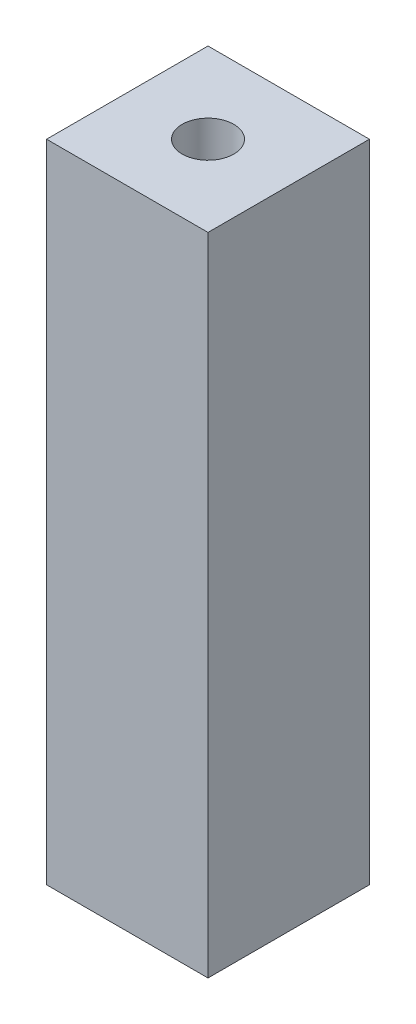
ISO-10303-21;
HEADER;
FILE_DESCRIPTION(('STEP AP214'),'2;1');
FILE_NAME('part.step','',(''),(''),'','','');
FILE_SCHEMA(('AUTOMOTIVE_DESIGN { 1 0 10303 214 1 1 1 1 }'));
ENDSEC;
DATA;
#1=APPLICATION_CONTEXT('core data for automotive mechanical design processes');
#2=APPLICATION_PROTOCOL_DEFINITION('international standard','automotive_design',2000,#1);
#3=PRODUCT_CONTEXT('',#1,'mechanical');
#4=PRODUCT('Part','Part','',(#3));
#5=PRODUCT_RELATED_PRODUCT_CATEGORY('part','',(#4));
#6=PRODUCT_DEFINITION_FORMATION('','',#4);
#7=PRODUCT_DEFINITION_CONTEXT('part definition',#1,'design');
#8=PRODUCT_DEFINITION('design','',#6,#7);
#9=PRODUCT_DEFINITION_SHAPE('','',#8);
#10=(LENGTH_UNIT() NAMED_UNIT(*) SI_UNIT(.MILLI.,.METRE.));
#11=(NAMED_UNIT(*) PLANE_ANGLE_UNIT() SI_UNIT($,.RADIAN.));
#12=(NAMED_UNIT(*) SI_UNIT($,.STERADIAN.) SOLID_ANGLE_UNIT());
#13=UNCERTAINTY_MEASURE_WITH_UNIT(LENGTH_MEASURE(1.E-05),#10,'distance_accuracy_value','');
#14=(GEOMETRIC_REPRESENTATION_CONTEXT(3) GLOBAL_UNCERTAINTY_ASSIGNED_CONTEXT((#13)) GLOBAL_UNIT_ASSIGNED_CONTEXT((#10,
#11,#12)) REPRESENTATION_CONTEXT('',''));
#15=CARTESIAN_POINT('',(0.,0.,0.));
#16=DIRECTION('',(0.,0.,1.));
#17=DIRECTION('',(1.,0.,0.));
#18=AXIS2_PLACEMENT_3D('',#15,#16,#17);
#19=CARTESIAN_POINT('',(0.,40.,0.));
#20=DIRECTION('',(0.,1.,0.));
#21=DIRECTION('',(0.,0.,1.));
#22=AXIS2_PLACEMENT_3D('',#19,#20,#21);
#23=PLANE('',#22);
#24=DIRECTION('',(0.,0.,-1.));
#25=VECTOR('',#24,1.);
#26=CARTESIAN_POINT('',(5.,40.,-5.));
#27=LINE('',#26,#25);
#28=CARTESIAN_POINT('',(5.,40.,5.));
#29=VERTEX_POINT('',#28);
#30=CARTESIAN_POINT('',(5.,40.,-5.));
#31=VERTEX_POINT('',#30);
#32=EDGE_CURVE('E88',#29,#31,#27,.T.);
#33=ORIENTED_EDGE('',*,*,#32,.T.);
#34=DIRECTION('',(-1.,0.,0.));
#35=VECTOR('',#34,1.);
#36=CARTESIAN_POINT('',(-5.,40.,-5.));
#37=LINE('',#36,#35);
#38=CARTESIAN_POINT('',(-5.,40.,-5.));
#39=VERTEX_POINT('',#38);
#40=EDGE_CURVE('E83',#31,#39,#37,.T.);
#41=ORIENTED_EDGE('',*,*,#40,.T.);
#42=DIRECTION('',(0.,0.,1.));
#43=VECTOR('',#42,1.);
#44=CARTESIAN_POINT('',(-5.,40.,-5.));
#45=LINE('',#44,#43);
#46=CARTESIAN_POINT('',(-5.,40.,5.));
#47=VERTEX_POINT('',#46);
#48=EDGE_CURVE('E86',#39,#47,#45,.T.);
#49=ORIENTED_EDGE('',*,*,#48,.T.);
#50=DIRECTION('',(1.,0.,0.));
#51=VECTOR('',#50,1.);
#52=CARTESIAN_POINT('',(-5.,40.,5.));
#53=LINE('',#52,#51);
#54=EDGE_CURVE('E53',#47,#29,#53,.T.);
#55=ORIENTED_EDGE('',*,*,#54,.T.);
#56=EDGE_LOOP('',(#33,#41,#49,#55));
#57=FACE_BOUND('',#56,.T.);
#58=CARTESIAN_POINT('',(0.,40.,0.));
#59=DIRECTION('',(0.,1.,0.));
#60=DIRECTION('',(0.,0.,1.));
#61=AXIS2_PLACEMENT_3D('',#58,#59,#60);
#62=CIRCLE('',#61,1.6);
#63=CARTESIAN_POINT('',(0.,40.,1.6));
#64=VERTEX_POINT('',#63);
#65=EDGE_CURVE('E103',#64,#64,#62,.T.);
#66=ORIENTED_EDGE('',*,*,#65,.F.);
#67=EDGE_LOOP('',(#66));
#68=FACE_BOUND('',#67,.T.);
#69=ADVANCED_FACE('F36',(#57,#68),#23,.T.);
#70=CARTESIAN_POINT('',(0.,0.,0.));
#71=DIRECTION('',(0.,1.,0.));
#72=DIRECTION('',(0.,0.,1.));
#73=AXIS2_PLACEMENT_3D('',#70,#71,#72);
#74=PLANE('',#73);
#75=DIRECTION('',(0.,0.,-1.));
#76=VECTOR('',#75,1.);
#77=CARTESIAN_POINT('',(5.,0.,-5.));
#78=LINE('',#77,#76);
#79=CARTESIAN_POINT('',(5.,0.,5.));
#80=VERTEX_POINT('',#79);
#81=CARTESIAN_POINT('',(5.,0.,-5.));
#82=VERTEX_POINT('',#81);
#83=EDGE_CURVE('E100',#80,#82,#78,.T.);
#84=ORIENTED_EDGE('',*,*,#83,.F.);
#85=DIRECTION('',(1.,0.,0.));
#86=VECTOR('',#85,1.);
#87=CARTESIAN_POINT('',(-5.,0.,5.));
#88=LINE('',#87,#86);
#89=CARTESIAN_POINT('',(-5.,0.,5.));
#90=VERTEX_POINT('',#89);
#91=EDGE_CURVE('E76',#90,#80,#88,.T.);
#92=ORIENTED_EDGE('',*,*,#91,.F.);
#93=DIRECTION('',(0.,0.,1.));
#94=VECTOR('',#93,1.);
#95=CARTESIAN_POINT('',(-5.,0.,-5.));
#96=LINE('',#95,#94);
#97=CARTESIAN_POINT('',(-5.,0.,-5.));
#98=VERTEX_POINT('',#97);
#99=EDGE_CURVE('E70',#98,#90,#96,.T.);
#100=ORIENTED_EDGE('',*,*,#99,.F.);
#101=DIRECTION('',(-1.,0.,0.));
#102=VECTOR('',#101,1.);
#103=CARTESIAN_POINT('',(-5.,0.,-5.));
#104=LINE('',#103,#102);
#105=EDGE_CURVE('E92',#82,#98,#104,.T.);
#106=ORIENTED_EDGE('',*,*,#105,.F.);
#107=EDGE_LOOP('',(#84,#92,#100,#106));
#108=FACE_BOUND('',#107,.T.);
#109=CARTESIAN_POINT('',(0.,0.,0.));
#110=DIRECTION('',(0.,1.,0.));
#111=DIRECTION('',(0.,0.,1.));
#112=AXIS2_PLACEMENT_3D('',#109,#110,#111);
#113=CIRCLE('',#112,1.6);
#114=CARTESIAN_POINT('',(0.,0.,1.6));
#115=VERTEX_POINT('',#114);
#116=EDGE_CURVE('E115',#115,#115,#113,.T.);
#117=ORIENTED_EDGE('',*,*,#116,.T.);
#118=EDGE_LOOP('',(#117));
#119=FACE_BOUND('',#118,.T.);
#120=ADVANCED_FACE('F111',(#108,#119),#74,.F.);
#121=CARTESIAN_POINT('',(5.,40.,-5.));
#122=DIRECTION('',(-1.,0.,0.));
#123=DIRECTION('',(0.,0.,1.));
#124=AXIS2_PLACEMENT_3D('',#121,#122,#123);
#125=PLANE('',#124);
#126=ORIENTED_EDGE('',*,*,#83,.T.);
#127=DIRECTION('',(0.,-1.,0.));
#128=VECTOR('',#127,1.);
#129=CARTESIAN_POINT('',(5.,40.,-5.));
#130=LINE('',#129,#128);
#131=EDGE_CURVE('E11',#31,#82,#130,.T.);
#132=ORIENTED_EDGE('',*,*,#131,.F.);
#133=ORIENTED_EDGE('',*,*,#32,.F.);
#134=DIRECTION('',(0.,-1.,0.));
#135=VECTOR('',#134,1.);
#136=CARTESIAN_POINT('',(5.,40.,5.));
#137=LINE('',#136,#135);
#138=EDGE_CURVE('E96',#29,#80,#137,.T.);
#139=ORIENTED_EDGE('',*,*,#138,.T.);
#140=EDGE_LOOP('',(#126,#132,#133,#139));
#141=FACE_BOUND('',#140,.T.);
#142=ADVANCED_FACE('F38',(#141),#125,.F.);
#143=CARTESIAN_POINT('',(-5.,40.,-5.));
#144=DIRECTION('',(0.,0.,1.));
#145=DIRECTION('',(1.,0.,0.));
#146=AXIS2_PLACEMENT_3D('',#143,#144,#145);
#147=PLANE('',#146);
#148=ORIENTED_EDGE('',*,*,#105,.T.);
#149=DIRECTION('',(0.,-1.,0.));
#150=VECTOR('',#149,1.);
#151=CARTESIAN_POINT('',(-5.,40.,-5.));
#152=LINE('',#151,#150);
#153=EDGE_CURVE('E45',#39,#98,#152,.T.);
#154=ORIENTED_EDGE('',*,*,#153,.F.);
#155=ORIENTED_EDGE('',*,*,#40,.F.);
#156=ORIENTED_EDGE('',*,*,#131,.T.);
#157=EDGE_LOOP('',(#148,#154,#155,#156));
#158=FACE_BOUND('',#157,.T.);
#159=ADVANCED_FACE('F91',(#158),#147,.F.);
#160=CARTESIAN_POINT('',(-5.,40.,-5.));
#161=DIRECTION('',(1.,0.,0.));
#162=DIRECTION('',(0.,0.,-1.));
#163=AXIS2_PLACEMENT_3D('',#160,#161,#162);
#164=PLANE('',#163);
#165=ORIENTED_EDGE('',*,*,#99,.T.);
#166=DIRECTION('',(0.,-1.,0.));
#167=VECTOR('',#166,1.);
#168=CARTESIAN_POINT('',(-5.,40.,5.));
#169=LINE('',#168,#167);
#170=EDGE_CURVE('E93',#47,#90,#169,.T.);
#171=ORIENTED_EDGE('',*,*,#170,.F.);
#172=ORIENTED_EDGE('',*,*,#48,.F.);
#173=ORIENTED_EDGE('',*,*,#153,.T.);
#174=EDGE_LOOP('',(#165,#171,#172,#173));
#175=FACE_BOUND('',#174,.T.);
#176=ADVANCED_FACE('F94',(#175),#164,.F.);
#177=CARTESIAN_POINT('',(-5.,40.,5.));
#178=DIRECTION('',(0.,0.,-1.));
#179=DIRECTION('',(-1.,0.,0.));
#180=AXIS2_PLACEMENT_3D('',#177,#178,#179);
#181=PLANE('',#180);
#182=ORIENTED_EDGE('',*,*,#91,.T.);
#183=ORIENTED_EDGE('',*,*,#138,.F.);
#184=ORIENTED_EDGE('',*,*,#54,.F.);
#185=ORIENTED_EDGE('',*,*,#170,.T.);
#186=EDGE_LOOP('',(#182,#183,#184,#185));
#187=FACE_BOUND('',#186,.T.);
#188=ADVANCED_FACE('F108',(#187),#181,.F.);
#189=CARTESIAN_POINT('',(0.,40.,0.));
#190=DIRECTION('',(0.,-1.,0.));
#191=DIRECTION('',(0.,0.,-1.));
#192=AXIS2_PLACEMENT_3D('',#189,#190,#191);
#193=CYLINDRICAL_SURFACE('',#192,1.6);
#194=ORIENTED_EDGE('',*,*,#65,.T.);
#195=EDGE_LOOP('',(#194));
#196=FACE_BOUND('',#195,.T.);
#197=ORIENTED_EDGE('',*,*,#116,.F.);
#198=EDGE_LOOP('',(#197));
#199=FACE_BOUND('',#198,.T.);
#200=ADVANCED_FACE('F121',(#196,#199),#193,.F.);
#201=CLOSED_SHELL('',(#69,#120,#142,#159,#176,#188,#200));
#202=MANIFOLD_SOLID_BREP('B2',#201);
#203=ADVANCED_BREP_SHAPE_REPRESENTATION('',(#18,#202),#14);
#204=SHAPE_DEFINITION_REPRESENTATION(#9,#203);
ENDSEC;
END-ISO-10303-21;
